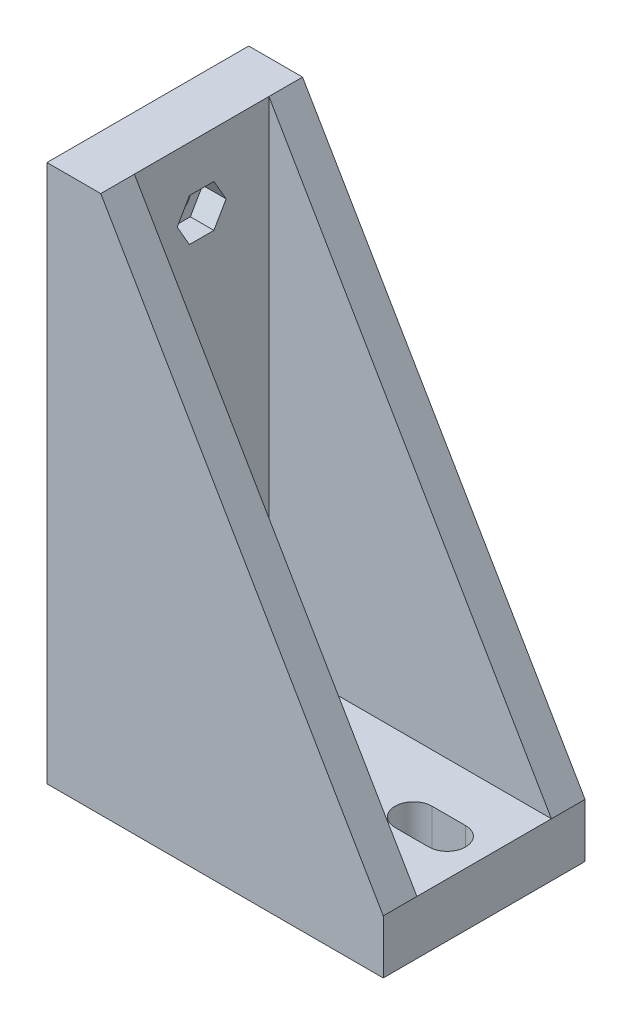
ISO-10303-21;
HEADER;
FILE_DESCRIPTION(('STEP AP214'),'2;1');
FILE_NAME('part.step','',(''),(''),'','','');
FILE_SCHEMA(('AUTOMOTIVE_DESIGN { 1 0 10303 214 1 1 1 1 }'));
ENDSEC;
DATA;
#1=APPLICATION_CONTEXT('core data for automotive mechanical design processes');
#2=APPLICATION_PROTOCOL_DEFINITION('international standard','automotive_design',2000,#1);
#3=PRODUCT_CONTEXT('',#1,'mechanical');
#4=PRODUCT('Part','Part','',(#3));
#5=PRODUCT_RELATED_PRODUCT_CATEGORY('part','',(#4));
#6=PRODUCT_DEFINITION_FORMATION('','',#4);
#7=PRODUCT_DEFINITION_CONTEXT('part definition',#1,'design');
#8=PRODUCT_DEFINITION('design','',#6,#7);
#9=PRODUCT_DEFINITION_SHAPE('','',#8);
#10=(LENGTH_UNIT() NAMED_UNIT(*) SI_UNIT(.MILLI.,.METRE.));
#11=(NAMED_UNIT(*) PLANE_ANGLE_UNIT() SI_UNIT($,.RADIAN.));
#12=(NAMED_UNIT(*) SI_UNIT($,.STERADIAN.) SOLID_ANGLE_UNIT());
#13=UNCERTAINTY_MEASURE_WITH_UNIT(LENGTH_MEASURE(1.E-05),#10,'distance_accuracy_value','');
#14=(GEOMETRIC_REPRESENTATION_CONTEXT(3) GLOBAL_UNCERTAINTY_ASSIGNED_CONTEXT((#13)) GLOBAL_UNIT_ASSIGNED_CONTEXT((#10,
#11,#12)) REPRESENTATION_CONTEXT('',''));
#15=CARTESIAN_POINT('',(0.,0.,0.));
#16=DIRECTION('',(0.,0.,1.));
#17=DIRECTION('',(1.,0.,0.));
#18=AXIS2_PLACEMENT_3D('',#15,#16,#17);
#19=CARTESIAN_POINT('',(8.,8.,15.));
#20=DIRECTION('',(0.,-1.,0.));
#21=DIRECTION('',(1.,0.,0.));
#22=AXIS2_PLACEMENT_3D('',#19,#20,#21);
#23=PLANE('',#22);
#24=DIRECTION('',(1.,0.,0.));
#25=VECTOR('',#24,1.);
#26=CARTESIAN_POINT('',(8.,8.,-10.));
#27=LINE('',#26,#25);
#28=CARTESIAN_POINT('',(8.,8.,-10.));
#29=VERTEX_POINT('',#28);
#30=CARTESIAN_POINT('',(50.,8.,-10.));
#31=VERTEX_POINT('',#30);
#32=EDGE_CURVE('E303',#29,#31,#27,.T.);
#33=ORIENTED_EDGE('',*,*,#32,.F.);
#34=DIRECTION('',(0.,0.,-1.));
#35=VECTOR('',#34,1.);
#36=CARTESIAN_POINT('',(8.,8.,15.));
#37=LINE('',#36,#35);
#38=CARTESIAN_POINT('',(8.,8.00000000000001,10.));
#39=VERTEX_POINT('',#38);
#40=EDGE_CURVE('E360',#39,#29,#37,.T.);
#41=ORIENTED_EDGE('',*,*,#40,.F.);
#42=DIRECTION('',(-1.,0.,0.));
#43=VECTOR('',#42,1.);
#44=CARTESIAN_POINT('',(8.,8.,10.));
#45=LINE('',#44,#43);
#46=CARTESIAN_POINT('',(50.,8.,10.));
#47=VERTEX_POINT('',#46);
#48=EDGE_CURVE('E317',#47,#39,#45,.T.);
#49=ORIENTED_EDGE('',*,*,#48,.F.);
#50=DIRECTION('',(0.,0.,-1.));
#51=VECTOR('',#50,1.);
#52=CARTESIAN_POINT('',(50.,8.,15.));
#53=LINE('',#52,#51);
#54=EDGE_CURVE('E364',#47,#31,#53,.T.);
#55=ORIENTED_EDGE('',*,*,#54,.T.);
#56=EDGE_LOOP('',(#33,#41,#49,#55));
#57=FACE_BOUND('',#56,.T.);
#58=DIRECTION('',(1.,0.,0.));
#59=VECTOR('',#58,1.);
#60=CARTESIAN_POINT('',(39.5,8.,-2.75));
#61=LINE('',#60,#59);
#62=CARTESIAN_POINT('',(39.5,8.,-2.75));
#63=VERTEX_POINT('',#62);
#64=CARTESIAN_POINT('',(44.5,8.,-2.75));
#65=VERTEX_POINT('',#64);
#66=EDGE_CURVE('E64',#63,#65,#61,.T.);
#67=ORIENTED_EDGE('',*,*,#66,.T.);
#68=CARTESIAN_POINT('',(44.5,8.,0.));
#69=DIRECTION('',(0.,1.,0.));
#70=DIRECTION('',(-1.,0.,0.));
#71=AXIS2_PLACEMENT_3D('',#68,#69,#70);
#72=CIRCLE('',#71,2.75);
#73=CARTESIAN_POINT('',(44.5,8.,2.75));
#74=VERTEX_POINT('',#73);
#75=EDGE_CURVE('E189',#74,#65,#72,.T.);
#76=ORIENTED_EDGE('',*,*,#75,.F.);
#77=DIRECTION('',(1.,0.,0.));
#78=VECTOR('',#77,1.);
#79=CARTESIAN_POINT('',(39.5,8.,2.75));
#80=LINE('',#79,#78);
#81=CARTESIAN_POINT('',(39.5,8.,2.75));
#82=VERTEX_POINT('',#81);
#83=EDGE_CURVE('E206',#82,#74,#80,.T.);
#84=ORIENTED_EDGE('',*,*,#83,.F.);
#85=CARTESIAN_POINT('',(39.5,8.,0.));
#86=DIRECTION('',(0.,1.,0.));
#87=DIRECTION('',(-1.,0.,0.));
#88=AXIS2_PLACEMENT_3D('',#85,#86,#87);
#89=CIRCLE('',#88,2.75);
#90=EDGE_CURVE('E183',#63,#82,#89,.T.);
#91=ORIENTED_EDGE('',*,*,#90,.F.);
#92=EDGE_LOOP('',(#67,#76,#84,#91));
#93=FACE_BOUND('',#92,.T.);
#94=ADVANCED_FACE('F47',(#57,#93),#23,.F.);
#95=CARTESIAN_POINT('',(50.,0.,15.));
#96=DIRECTION('',(0.,1.,0.));
#97=DIRECTION('',(-1.,0.,0.));
#98=AXIS2_PLACEMENT_3D('',#95,#96,#97);
#99=PLANE('',#98);
#100=DIRECTION('',(1.,0.,0.));
#101=VECTOR('',#100,1.);
#102=CARTESIAN_POINT('',(50.,0.,-15.));
#103=LINE('',#102,#101);
#104=CARTESIAN_POINT('',(0.,0.,-15.));
#105=VERTEX_POINT('',#104);
#106=CARTESIAN_POINT('',(50.,0.,-15.));
#107=VERTEX_POINT('',#106);
#108=EDGE_CURVE('E320',#105,#107,#103,.T.);
#109=ORIENTED_EDGE('',*,*,#108,.T.);
#110=DIRECTION('',(0.,0.,-1.));
#111=VECTOR('',#110,1.);
#112=CARTESIAN_POINT('',(50.,0.,15.));
#113=LINE('',#112,#111);
#114=CARTESIAN_POINT('',(50.,0.,15.));
#115=VERTEX_POINT('',#114);
#116=EDGE_CURVE('E12',#115,#107,#113,.T.);
#117=ORIENTED_EDGE('',*,*,#116,.F.);
#118=DIRECTION('',(1.,0.,0.));
#119=VECTOR('',#118,1.);
#120=CARTESIAN_POINT('',(50.,0.,15.));
#121=LINE('',#120,#119);
#122=CARTESIAN_POINT('',(0.,0.,15.));
#123=VERTEX_POINT('',#122);
#124=EDGE_CURVE('E321',#123,#115,#121,.T.);
#125=ORIENTED_EDGE('',*,*,#124,.F.);
#126=DIRECTION('',(0.,0.,-1.));
#127=VECTOR('',#126,1.);
#128=CARTESIAN_POINT('',(0.,0.,15.));
#129=LINE('',#128,#127);
#130=EDGE_CURVE('E336',#123,#105,#129,.T.);
#131=ORIENTED_EDGE('',*,*,#130,.T.);
#132=EDGE_LOOP('',(#109,#117,#125,#131));
#133=FACE_BOUND('',#132,.T.);
#134=DIRECTION('',(1.,0.,0.));
#135=VECTOR('',#134,1.);
#136=CARTESIAN_POINT('',(39.5,0.,-2.75));
#137=LINE('',#136,#135);
#138=CARTESIAN_POINT('',(39.5,0.,-2.75));
#139=VERTEX_POINT('',#138);
#140=CARTESIAN_POINT('',(44.5,0.,-2.75));
#141=VERTEX_POINT('',#140);
#142=EDGE_CURVE('E171',#139,#141,#137,.T.);
#143=ORIENTED_EDGE('',*,*,#142,.F.);
#144=CARTESIAN_POINT('',(39.5,0.,0.));
#145=DIRECTION('',(0.,1.,0.));
#146=DIRECTION('',(-1.,0.,0.));
#147=AXIS2_PLACEMENT_3D('',#144,#145,#146);
#148=CIRCLE('',#147,2.75);
#149=CARTESIAN_POINT('',(39.5,0.,2.75));
#150=VERTEX_POINT('',#149);
#151=EDGE_CURVE('E197',#139,#150,#148,.T.);
#152=ORIENTED_EDGE('',*,*,#151,.T.);
#153=DIRECTION('',(1.,0.,0.));
#154=VECTOR('',#153,1.);
#155=CARTESIAN_POINT('',(39.5,0.,2.75));
#156=LINE('',#155,#154);
#157=CARTESIAN_POINT('',(44.5,0.,2.75));
#158=VERTEX_POINT('',#157);
#159=EDGE_CURVE('E72',#150,#158,#156,.T.);
#160=ORIENTED_EDGE('',*,*,#159,.T.);
#161=CARTESIAN_POINT('',(44.5,0.,0.));
#162=DIRECTION('',(0.,1.,0.));
#163=DIRECTION('',(-1.,0.,0.));
#164=AXIS2_PLACEMENT_3D('',#161,#162,#163);
#165=CIRCLE('',#164,2.75);
#166=EDGE_CURVE('E182',#158,#141,#165,.T.);
#167=ORIENTED_EDGE('',*,*,#166,.T.);
#168=EDGE_LOOP('',(#143,#152,#160,#167));
#169=FACE_BOUND('',#168,.T.);
#170=ADVANCED_FACE('F49',(#133,#169),#99,.F.);
#171=CARTESIAN_POINT('',(8.,70.,0.));
#172=DIRECTION('',(1.,0.,0.));
#173=DIRECTION('',(0.,0.,-1.));
#174=AXIS2_PLACEMENT_3D('',#171,#172,#173);
#175=CYLINDRICAL_SURFACE('',#174,1.8);
#176=CARTESIAN_POINT('',(0.,70.,0.));
#177=DIRECTION('',(1.,0.,0.));
#178=DIRECTION('',(0.,0.,-1.));
#179=AXIS2_PLACEMENT_3D('',#176,#177,#178);
#180=CIRCLE('',#179,1.8);
#181=CARTESIAN_POINT('',(0.,70.,-1.8));
#182=VERTEX_POINT('',#181);
#183=EDGE_CURVE('E279',#182,#182,#180,.T.);
#184=ORIENTED_EDGE('',*,*,#183,.F.);
#185=EDGE_LOOP('',(#184));
#186=FACE_BOUND('',#185,.T.);
#187=CARTESIAN_POINT('',(4.5,70.,0.));
#188=DIRECTION('',(1.,0.,0.));
#189=DIRECTION('',(0.,0.,-1.));
#190=AXIS2_PLACEMENT_3D('',#187,#188,#189);
#191=CIRCLE('',#190,1.8);
#192=CARTESIAN_POINT('',(4.5,70.,-1.8));
#193=VERTEX_POINT('',#192);
#194=EDGE_CURVE('E51',#193,#193,#191,.F.);
#195=ORIENTED_EDGE('',*,*,#194,.F.);
#196=EDGE_LOOP('',(#195));
#197=FACE_BOUND('',#196,.T.);
#198=ADVANCED_FACE('F415',(#186,#197),#175,.F.);
#199=CARTESIAN_POINT('',(8.,80.,15.));
#200=DIRECTION('',(-1.,0.,0.));
#201=DIRECTION('',(0.,-1.,0.));
#202=AXIS2_PLACEMENT_3D('',#199,#200,#201);
#203=PLANE('',#202);
#204=DIRECTION('',(0.,0.866025403784439,0.499999999999999));
#205=VECTOR('',#204,1.);
#206=CARTESIAN_POINT('',(8.,70.,-3.63730669589465));
#207=LINE('',#206,#205);
#208=CARTESIAN_POINT('',(8.,70.,-3.63730669589465));
#209=VERTEX_POINT('',#208);
#210=CARTESIAN_POINT('',(8.,73.15,-1.81865334794733));
#211=VERTEX_POINT('',#210);
#212=EDGE_CURVE('E239',#209,#211,#207,.T.);
#213=ORIENTED_EDGE('',*,*,#212,.F.);
#214=DIRECTION('',(0.,0.866025403784438,-0.500000000000001));
#215=VECTOR('',#214,1.);
#216=CARTESIAN_POINT('',(8.,66.85,-1.81865334794732));
#217=LINE('',#216,#215);
#218=CARTESIAN_POINT('',(8.,66.85,-1.81865334794732));
#219=VERTEX_POINT('',#218);
#220=EDGE_CURVE('E191',#219,#209,#217,.T.);
#221=ORIENTED_EDGE('',*,*,#220,.F.);
#222=DIRECTION('',(0.,0.,-1.));
#223=VECTOR('',#222,1.);
#224=CARTESIAN_POINT('',(8.,66.85,1.81865334794732));
#225=LINE('',#224,#223);
#226=CARTESIAN_POINT('',(8.,66.85,1.81865334794732));
#227=VERTEX_POINT('',#226);
#228=EDGE_CURVE('E255',#227,#219,#225,.T.);
#229=ORIENTED_EDGE('',*,*,#228,.F.);
#230=DIRECTION('',(0.,-0.866025403784439,-0.5));
#231=VECTOR('',#230,1.);
#232=CARTESIAN_POINT('',(8.,70.,3.63730669589465));
#233=LINE('',#232,#231);
#234=CARTESIAN_POINT('',(8.,70.,3.63730669589465));
#235=VERTEX_POINT('',#234);
#236=EDGE_CURVE('E251',#235,#227,#233,.T.);
#237=ORIENTED_EDGE('',*,*,#236,.F.);
#238=DIRECTION('',(0.,-0.866025403784438,0.5));
#239=VECTOR('',#238,1.);
#240=CARTESIAN_POINT('',(8.,73.15,1.81865334794732));
#241=LINE('',#240,#239);
#242=CARTESIAN_POINT('',(8.,73.15,1.81865334794732));
#243=VERTEX_POINT('',#242);
#244=EDGE_CURVE('E247',#243,#235,#241,.T.);
#245=ORIENTED_EDGE('',*,*,#244,.F.);
#246=DIRECTION('',(0.,0.,1.));
#247=VECTOR('',#246,1.);
#248=CARTESIAN_POINT('',(8.,73.15,-1.81865334794733));
#249=LINE('',#248,#247);
#250=EDGE_CURVE('E243',#211,#243,#249,.T.);
#251=ORIENTED_EDGE('',*,*,#250,.F.);
#252=EDGE_LOOP('',(#213,#221,#229,#237,#245,#251));
#253=FACE_BOUND('',#252,.T.);
#254=DIRECTION('',(0.,-1.,0.));
#255=VECTOR('',#254,1.);
#256=CARTESIAN_POINT('',(8.,80.,-10.));
#257=LINE('',#256,#255);
#258=CARTESIAN_POINT('',(8.,80.,-10.));
#259=VERTEX_POINT('',#258);
#260=EDGE_CURVE('E299',#259,#29,#257,.T.);
#261=ORIENTED_EDGE('',*,*,#260,.F.);
#262=DIRECTION('',(0.,0.,-1.));
#263=VECTOR('',#262,1.);
#264=CARTESIAN_POINT('',(8.,80.,15.));
#265=LINE('',#264,#263);
#266=CARTESIAN_POINT('',(8.,80.,10.));
#267=VERTEX_POINT('',#266);
#268=EDGE_CURVE('E355',#267,#259,#265,.T.);
#269=ORIENTED_EDGE('',*,*,#268,.F.);
#270=DIRECTION('',(0.,1.,0.));
#271=VECTOR('',#270,1.);
#272=CARTESIAN_POINT('',(8.,80.,10.));
#273=LINE('',#272,#271);
#274=EDGE_CURVE('E311',#39,#267,#273,.T.);
#275=ORIENTED_EDGE('',*,*,#274,.F.);
#276=ORIENTED_EDGE('',*,*,#40,.T.);
#277=EDGE_LOOP('',(#261,#269,#275,#276));
#278=FACE_BOUND('',#277,.T.);
#279=ADVANCED_FACE('F407',(#253,#278),#203,.F.);
#280=CARTESIAN_POINT('',(50.,8.,15.));
#281=DIRECTION('',(-1.,0.,0.));
#282=DIRECTION('',(0.,0.,1.));
#283=AXIS2_PLACEMENT_3D('',#280,#281,#282);
#284=PLANE('',#283);
#285=DIRECTION('',(0.,0.,-1.));
#286=VECTOR('',#285,1.);
#287=CARTESIAN_POINT('',(50.,7.99999999999999,15.));
#288=LINE('',#287,#286);
#289=CARTESIAN_POINT('',(50.,8.,-15.));
#290=VERTEX_POINT('',#289);
#291=EDGE_CURVE('E295',#31,#290,#288,.T.);
#292=ORIENTED_EDGE('',*,*,#291,.F.);
#293=ORIENTED_EDGE('',*,*,#54,.F.);
#294=CARTESIAN_POINT('',(50.,8.00000000000005,15.));
#295=VERTEX_POINT('',#294);
#296=EDGE_CURVE('E57',#295,#47,#53,.T.);
#297=ORIENTED_EDGE('',*,*,#296,.F.);
#298=DIRECTION('',(0.,1.,0.));
#299=VECTOR('',#298,1.);
#300=CARTESIAN_POINT('',(50.,8.,15.));
#301=LINE('',#300,#299);
#302=EDGE_CURVE('E325',#115,#295,#301,.T.);
#303=ORIENTED_EDGE('',*,*,#302,.F.);
#304=ORIENTED_EDGE('',*,*,#116,.T.);
#305=DIRECTION('',(0.,1.,0.));
#306=VECTOR('',#305,1.);
#307=CARTESIAN_POINT('',(50.,8.,-15.));
#308=LINE('',#307,#306);
#309=EDGE_CURVE('E340',#107,#290,#308,.T.);
#310=ORIENTED_EDGE('',*,*,#309,.T.);
#311=EDGE_LOOP('',(#292,#293,#297,#303,#304,#310));
#312=FACE_BOUND('',#311,.T.);
#313=ADVANCED_FACE('F423',(#312),#284,.F.);
#314=CARTESIAN_POINT('',(0.,80.,15.));
#315=DIRECTION('',(0.,-1.,0.));
#316=DIRECTION('',(0.,0.,-1.));
#317=AXIS2_PLACEMENT_3D('',#314,#315,#316);
#318=PLANE('',#317);
#319=DIRECTION('',(-1.,0.,0.));
#320=VECTOR('',#319,1.);
#321=CARTESIAN_POINT('',(0.,80.,-15.));
#322=LINE('',#321,#320);
#323=CARTESIAN_POINT('',(8.,80.,-15.));
#324=VERTEX_POINT('',#323);
#325=CARTESIAN_POINT('',(0.,80.,-15.));
#326=VERTEX_POINT('',#325);
#327=EDGE_CURVE('E343',#324,#326,#322,.T.);
#328=ORIENTED_EDGE('',*,*,#327,.T.);
#329=DIRECTION('',(0.,0.,-1.));
#330=VECTOR('',#329,1.);
#331=CARTESIAN_POINT('',(0.,80.,15.));
#332=LINE('',#331,#330);
#333=CARTESIAN_POINT('',(0.,80.,15.));
#334=VERTEX_POINT('',#333);
#335=EDGE_CURVE('E352',#334,#326,#332,.T.);
#336=ORIENTED_EDGE('',*,*,#335,.F.);
#337=DIRECTION('',(-1.,0.,0.));
#338=VECTOR('',#337,1.);
#339=CARTESIAN_POINT('',(0.,80.,15.));
#340=LINE('',#339,#338);
#341=CARTESIAN_POINT('',(8.,80.,15.));
#342=VERTEX_POINT('',#341);
#343=EDGE_CURVE('E330',#342,#334,#340,.T.);
#344=ORIENTED_EDGE('',*,*,#343,.F.);
#345=EDGE_CURVE('E356',#342,#267,#265,.T.);
#346=ORIENTED_EDGE('',*,*,#345,.T.);
#347=ORIENTED_EDGE('',*,*,#268,.T.);
#348=DIRECTION('',(0.,0.,1.));
#349=VECTOR('',#348,1.);
#350=CARTESIAN_POINT('',(8.,80.,15.));
#351=LINE('',#350,#349);
#352=EDGE_CURVE('E288',#324,#259,#351,.T.);
#353=ORIENTED_EDGE('',*,*,#352,.F.);
#354=EDGE_LOOP('',(#328,#336,#344,#346,#347,#353));
#355=FACE_BOUND('',#354,.T.);
#356=ADVANCED_FACE('F386',(#355),#318,.F.);
#357=CARTESIAN_POINT('',(0.,0.,15.));
#358=DIRECTION('',(1.,0.,0.));
#359=DIRECTION('',(0.,0.,-1.));
#360=AXIS2_PLACEMENT_3D('',#357,#358,#359);
#361=PLANE('',#360);
#362=ORIENTED_EDGE('',*,*,#183,.T.);
#363=EDGE_LOOP('',(#362));
#364=FACE_BOUND('',#363,.T.);
#365=DIRECTION('',(0.,-1.,0.));
#366=VECTOR('',#365,1.);
#367=CARTESIAN_POINT('',(0.,0.,-15.));
#368=LINE('',#367,#366);
#369=EDGE_CURVE('E326',#326,#105,#368,.T.);
#370=ORIENTED_EDGE('',*,*,#369,.T.);
#371=ORIENTED_EDGE('',*,*,#130,.F.);
#372=DIRECTION('',(0.,-1.,0.));
#373=VECTOR('',#372,1.);
#374=CARTESIAN_POINT('',(0.,0.,15.));
#375=LINE('',#374,#373);
#376=EDGE_CURVE('E333',#334,#123,#375,.T.);
#377=ORIENTED_EDGE('',*,*,#376,.F.);
#378=ORIENTED_EDGE('',*,*,#335,.T.);
#379=EDGE_LOOP('',(#370,#371,#377,#378));
#380=FACE_BOUND('',#379,.T.);
#381=ADVANCED_FACE('F396',(#364,#380),#361,.F.);
#382=CARTESIAN_POINT('',(0.,0.,15.));
#383=DIRECTION('',(0.,0.,-1.));
#384=DIRECTION('',(-1.,0.,0.));
#385=AXIS2_PLACEMENT_3D('',#382,#383,#384);
#386=PLANE('',#385);
#387=ORIENTED_EDGE('',*,*,#124,.T.);
#388=ORIENTED_EDGE('',*,*,#302,.T.);
#389=DIRECTION('',(0.503871025524086,-0.863778900898433,0.));
#390=VECTOR('',#389,1.);
#391=CARTESIAN_POINT('',(8.,80.,15.));
#392=LINE('',#391,#390);
#393=EDGE_CURVE('E308',#342,#295,#392,.T.);
#394=ORIENTED_EDGE('',*,*,#393,.F.);
#395=ORIENTED_EDGE('',*,*,#343,.T.);
#396=ORIENTED_EDGE('',*,*,#376,.T.);
#397=EDGE_LOOP('',(#387,#388,#394,#395,#396));
#398=FACE_BOUND('',#397,.T.);
#399=ADVANCED_FACE('F402',(#398),#386,.F.);
#400=CARTESIAN_POINT('',(0.,0.,-15.));
#401=DIRECTION('',(0.,0.,-1.));
#402=DIRECTION('',(-1.,0.,0.));
#403=AXIS2_PLACEMENT_3D('',#400,#401,#402);
#404=PLANE('',#403);
#405=ORIENTED_EDGE('',*,*,#327,.F.);
#406=DIRECTION('',(0.503871025524086,-0.863778900898433,0.));
#407=VECTOR('',#406,1.);
#408=CARTESIAN_POINT('',(8.,80.,-15.));
#409=LINE('',#408,#407);
#410=EDGE_CURVE('E284',#324,#290,#409,.T.);
#411=ORIENTED_EDGE('',*,*,#410,.T.);
#412=ORIENTED_EDGE('',*,*,#309,.F.);
#413=ORIENTED_EDGE('',*,*,#108,.F.);
#414=ORIENTED_EDGE('',*,*,#369,.F.);
#415=EDGE_LOOP('',(#405,#411,#412,#413,#414));
#416=FACE_BOUND('',#415,.T.);
#417=ADVANCED_FACE('F391',(#416),#404,.T.);
#418=CARTESIAN_POINT('',(25.,40.,10.));
#419=DIRECTION('',(0.,0.,1.));
#420=DIRECTION('',(1.,0.,0.));
#421=AXIS2_PLACEMENT_3D('',#418,#419,#420);
#422=PLANE('',#421);
#423=DIRECTION('',(0.503871025524086,-0.863778900898433,0.));
#424=VECTOR('',#423,1.);
#425=CARTESIAN_POINT('',(8.,80.,10.));
#426=LINE('',#425,#424);
#427=EDGE_CURVE('E307',#267,#47,#426,.T.);
#428=ORIENTED_EDGE('',*,*,#427,.T.);
#429=ORIENTED_EDGE('',*,*,#48,.T.);
#430=ORIENTED_EDGE('',*,*,#274,.T.);
#431=EDGE_LOOP('',(#428,#429,#430));
#432=FACE_BOUND('',#431,.T.);
#433=ADVANCED_FACE('F450',(#432),#422,.F.);
#434=CARTESIAN_POINT('',(8.,80.,15.));
#435=DIRECTION('',(-0.863778900898434,-0.503871025524086,0.));
#436=DIRECTION('',(0.503871025524086,-0.863778900898433,0.));
#437=AXIS2_PLACEMENT_3D('',#434,#435,#436);
#438=PLANE('',#437);
#439=ORIENTED_EDGE('',*,*,#296,.T.);
#440=ORIENTED_EDGE('',*,*,#427,.F.);
#441=ORIENTED_EDGE('',*,*,#345,.F.);
#442=ORIENTED_EDGE('',*,*,#393,.T.);
#443=EDGE_LOOP('',(#439,#440,#441,#442));
#444=FACE_BOUND('',#443,.T.);
#445=ADVANCED_FACE('F403',(#444),#438,.F.);
#446=CARTESIAN_POINT('',(25.,40.,-10.));
#447=DIRECTION('',(0.,0.,-1.));
#448=DIRECTION('',(-1.,0.,0.));
#449=AXIS2_PLACEMENT_3D('',#446,#447,#448);
#450=PLANE('',#449);
#451=ORIENTED_EDGE('',*,*,#260,.T.);
#452=ORIENTED_EDGE('',*,*,#32,.T.);
#453=DIRECTION('',(0.503871025524086,-0.863778900898433,0.));
#454=VECTOR('',#453,1.);
#455=CARTESIAN_POINT('',(8.,80.,-10.));
#456=LINE('',#455,#454);
#457=EDGE_CURVE('E283',#259,#31,#456,.T.);
#458=ORIENTED_EDGE('',*,*,#457,.F.);
#459=EDGE_LOOP('',(#451,#452,#458));
#460=FACE_BOUND('',#459,.T.);
#461=ADVANCED_FACE('F379',(#460),#450,.F.);
#462=CARTESIAN_POINT('',(8.,80.,-15.));
#463=DIRECTION('',(0.863778900898434,0.503871025524086,0.));
#464=DIRECTION('',(0.503871025524086,-0.863778900898433,0.));
#465=AXIS2_PLACEMENT_3D('',#462,#463,#464);
#466=PLANE('',#465);
#467=ORIENTED_EDGE('',*,*,#457,.T.);
#468=ORIENTED_EDGE('',*,*,#291,.T.);
#469=ORIENTED_EDGE('',*,*,#410,.F.);
#470=ORIENTED_EDGE('',*,*,#352,.T.);
#471=EDGE_LOOP('',(#467,#468,#469,#470));
#472=FACE_BOUND('',#471,.T.);
#473=ADVANCED_FACE('F381',(#472),#466,.T.);
#474=CARTESIAN_POINT('',(4.5,0.,15.));
#475=DIRECTION('',(1.,0.,0.));
#476=DIRECTION('',(0.,0.,-1.));
#477=AXIS2_PLACEMENT_3D('',#474,#475,#476);
#478=PLANE('',#477);
#479=DIRECTION('',(0.,-0.866025403784438,0.500000000000001));
#480=VECTOR('',#479,1.);
#481=CARTESIAN_POINT('',(4.5,66.85,-1.81865334794732));
#482=LINE('',#481,#480);
#483=CARTESIAN_POINT('',(4.5,70.,-3.63730669589465));
#484=VERTEX_POINT('',#483);
#485=CARTESIAN_POINT('',(4.5,66.85,-1.81865334794732));
#486=VERTEX_POINT('',#485);
#487=EDGE_CURVE('E233',#484,#486,#482,.T.);
#488=ORIENTED_EDGE('',*,*,#487,.F.);
#489=DIRECTION('',(0.,-0.866025403784439,-0.499999999999999));
#490=VECTOR('',#489,1.);
#491=CARTESIAN_POINT('',(4.5,70.,-3.63730669589465));
#492=LINE('',#491,#490);
#493=CARTESIAN_POINT('',(4.5,73.15,-1.81865334794733));
#494=VERTEX_POINT('',#493);
#495=EDGE_CURVE('E236',#494,#484,#492,.T.);
#496=ORIENTED_EDGE('',*,*,#495,.F.);
#497=DIRECTION('',(0.,0.,-1.));
#498=VECTOR('',#497,1.);
#499=CARTESIAN_POINT('',(4.5,73.15,-1.81865334794733));
#500=LINE('',#499,#498);
#501=CARTESIAN_POINT('',(4.5,73.15,1.81865334794732));
#502=VERTEX_POINT('',#501);
#503=EDGE_CURVE('E220',#502,#494,#500,.T.);
#504=ORIENTED_EDGE('',*,*,#503,.F.);
#505=DIRECTION('',(0.,0.866025403784439,-0.5));
#506=VECTOR('',#505,1.);
#507=CARTESIAN_POINT('',(4.5,73.15,1.81865334794732));
#508=LINE('',#507,#506);
#509=CARTESIAN_POINT('',(4.5,70.,3.63730669589465));
#510=VERTEX_POINT('',#509);
#511=EDGE_CURVE('E223',#510,#502,#508,.T.);
#512=ORIENTED_EDGE('',*,*,#511,.F.);
#513=DIRECTION('',(0.,0.866025403784439,0.5));
#514=VECTOR('',#513,1.);
#515=CARTESIAN_POINT('',(4.5,70.,3.63730669589465));
#516=LINE('',#515,#514);
#517=CARTESIAN_POINT('',(4.5,66.85,1.81865334794732));
#518=VERTEX_POINT('',#517);
#519=EDGE_CURVE('E227',#518,#510,#516,.T.);
#520=ORIENTED_EDGE('',*,*,#519,.F.);
#521=DIRECTION('',(0.,0.,1.));
#522=VECTOR('',#521,1.);
#523=CARTESIAN_POINT('',(4.5,66.85,1.81865334794732));
#524=LINE('',#523,#522);
#525=EDGE_CURVE('E230',#486,#518,#524,.T.);
#526=ORIENTED_EDGE('',*,*,#525,.F.);
#527=EDGE_LOOP('',(#488,#496,#504,#512,#520,#526));
#528=FACE_BOUND('',#527,.T.);
#529=ORIENTED_EDGE('',*,*,#194,.T.);
#530=EDGE_LOOP('',(#529));
#531=FACE_BOUND('',#530,.T.);
#532=ADVANCED_FACE('F413',(#528,#531),#478,.T.);
#533=CARTESIAN_POINT('',(-9.62340895940728,66.85,-1.81865334794732));
#534=DIRECTION('',(0.,-0.500000000000001,-0.866025403784438));
#535=DIRECTION('',(0.,0.866025403784438,-0.500000000000001));
#536=AXIS2_PLACEMENT_3D('',#533,#534,#535);
#537=PLANE('',#536);
#538=ORIENTED_EDGE('',*,*,#487,.T.);
#539=DIRECTION('',(1.,0.,0.));
#540=VECTOR('',#539,1.);
#541=CARTESIAN_POINT('',(-9.62340895940728,66.85,-1.81865334794732));
#542=LINE('',#541,#540);
#543=EDGE_CURVE('E224',#486,#219,#542,.T.);
#544=ORIENTED_EDGE('',*,*,#543,.T.);
#545=ORIENTED_EDGE('',*,*,#220,.T.);
#546=DIRECTION('',(1.,0.,0.));
#547=VECTOR('',#546,1.);
#548=CARTESIAN_POINT('',(-9.62340895940728,70.,-3.63730669589465));
#549=LINE('',#548,#547);
#550=EDGE_CURVE('E259',#484,#209,#549,.T.);
#551=ORIENTED_EDGE('',*,*,#550,.F.);
#552=EDGE_LOOP('',(#538,#544,#545,#551));
#553=FACE_BOUND('',#552,.T.);
#554=ADVANCED_FACE('F518',(#553),#537,.F.);
#555=CARTESIAN_POINT('',(-9.62340895940728,66.85,1.81865334794732));
#556=DIRECTION('',(0.,-1.,0.));
#557=DIRECTION('',(1.,0.,0.));
#558=AXIS2_PLACEMENT_3D('',#555,#556,#557);
#559=PLANE('',#558);
#560=ORIENTED_EDGE('',*,*,#525,.T.);
#561=DIRECTION('',(1.,0.,0.));
#562=VECTOR('',#561,1.);
#563=CARTESIAN_POINT('',(-9.62340895940728,66.85,1.81865334794732));
#564=LINE('',#563,#562);
#565=EDGE_CURVE('E262',#518,#227,#564,.T.);
#566=ORIENTED_EDGE('',*,*,#565,.T.);
#567=ORIENTED_EDGE('',*,*,#228,.T.);
#568=ORIENTED_EDGE('',*,*,#543,.F.);
#569=EDGE_LOOP('',(#560,#566,#567,#568));
#570=FACE_BOUND('',#569,.T.);
#571=ADVANCED_FACE('F527',(#570),#559,.F.);
#572=CARTESIAN_POINT('',(-9.62340895940728,70.,3.63730669589465));
#573=DIRECTION('',(0.,-0.5,0.866025403784439));
#574=DIRECTION('',(0.,-0.866025403784439,-0.5));
#575=AXIS2_PLACEMENT_3D('',#572,#573,#574);
#576=PLANE('',#575);
#577=ORIENTED_EDGE('',*,*,#519,.T.);
#578=DIRECTION('',(1.,0.,0.));
#579=VECTOR('',#578,1.);
#580=CARTESIAN_POINT('',(-9.62340895940728,70.,3.63730669589465));
#581=LINE('',#580,#579);
#582=EDGE_CURVE('E265',#510,#235,#581,.T.);
#583=ORIENTED_EDGE('',*,*,#582,.T.);
#584=ORIENTED_EDGE('',*,*,#236,.T.);
#585=ORIENTED_EDGE('',*,*,#565,.F.);
#586=EDGE_LOOP('',(#577,#583,#584,#585));
#587=FACE_BOUND('',#586,.T.);
#588=ADVANCED_FACE('F535',(#587),#576,.F.);
#589=CARTESIAN_POINT('',(-9.62340895940728,73.15,1.81865334794732));
#590=DIRECTION('',(0.,0.5,0.866025403784438));
#591=DIRECTION('',(0.,-0.866025403784439,0.5));
#592=AXIS2_PLACEMENT_3D('',#589,#590,#591);
#593=PLANE('',#592);
#594=ORIENTED_EDGE('',*,*,#511,.T.);
#595=DIRECTION('',(1.,0.,0.));
#596=VECTOR('',#595,1.);
#597=CARTESIAN_POINT('',(-9.62340895940728,73.15,1.81865334794732));
#598=LINE('',#597,#596);
#599=EDGE_CURVE('E268',#502,#243,#598,.T.);
#600=ORIENTED_EDGE('',*,*,#599,.T.);
#601=ORIENTED_EDGE('',*,*,#244,.T.);
#602=ORIENTED_EDGE('',*,*,#582,.F.);
#603=EDGE_LOOP('',(#594,#600,#601,#602));
#604=FACE_BOUND('',#603,.T.);
#605=ADVANCED_FACE('F544',(#604),#593,.F.);
#606=CARTESIAN_POINT('',(-9.62340895940728,73.15,-1.81865334794733));
#607=DIRECTION('',(0.,1.,0.));
#608=DIRECTION('',(-1.,0.,0.));
#609=AXIS2_PLACEMENT_3D('',#606,#607,#608);
#610=PLANE('',#609);
#611=ORIENTED_EDGE('',*,*,#503,.T.);
#612=DIRECTION('',(1.,0.,0.));
#613=VECTOR('',#612,1.);
#614=CARTESIAN_POINT('',(-9.62340895940728,73.15,-1.81865334794733));
#615=LINE('',#614,#613);
#616=EDGE_CURVE('E271',#494,#211,#615,.T.);
#617=ORIENTED_EDGE('',*,*,#616,.T.);
#618=ORIENTED_EDGE('',*,*,#250,.T.);
#619=ORIENTED_EDGE('',*,*,#599,.F.);
#620=EDGE_LOOP('',(#611,#617,#618,#619));
#621=FACE_BOUND('',#620,.T.);
#622=ADVANCED_FACE('F553',(#621),#610,.F.);
#623=CARTESIAN_POINT('',(-9.62340895940728,70.,-3.63730669589465));
#624=DIRECTION('',(0.,0.499999999999999,-0.866025403784439));
#625=DIRECTION('',(0.,0.866025403784439,0.499999999999999));
#626=AXIS2_PLACEMENT_3D('',#623,#624,#625);
#627=PLANE('',#626);
#628=ORIENTED_EDGE('',*,*,#495,.T.);
#629=ORIENTED_EDGE('',*,*,#550,.T.);
#630=ORIENTED_EDGE('',*,*,#212,.T.);
#631=ORIENTED_EDGE('',*,*,#616,.F.);
#632=EDGE_LOOP('',(#628,#629,#630,#631));
#633=FACE_BOUND('',#632,.T.);
#634=ADVANCED_FACE('F561',(#633),#627,.F.);
#635=CARTESIAN_POINT('',(39.5,0.,-2.75));
#636=DIRECTION('',(0.,0.,1.));
#637=DIRECTION('',(1.,0.,0.));
#638=AXIS2_PLACEMENT_3D('',#635,#636,#637);
#639=PLANE('',#638);
#640=ORIENTED_EDGE('',*,*,#66,.F.);
#641=DIRECTION('',(0.,1.,0.));
#642=VECTOR('',#641,1.);
#643=CARTESIAN_POINT('',(39.5,0.,-2.75));
#644=LINE('',#643,#642);
#645=EDGE_CURVE('E176',#139,#63,#644,.T.);
#646=ORIENTED_EDGE('',*,*,#645,.F.);
#647=ORIENTED_EDGE('',*,*,#142,.T.);
#648=DIRECTION('',(0.,1.,0.));
#649=VECTOR('',#648,1.);
#650=CARTESIAN_POINT('',(44.5,0.,-2.75));
#651=LINE('',#650,#649);
#652=EDGE_CURVE('E174',#141,#65,#651,.T.);
#653=ORIENTED_EDGE('',*,*,#652,.T.);
#654=EDGE_LOOP('',(#640,#646,#647,#653));
#655=FACE_BOUND('',#654,.T.);
#656=ADVANCED_FACE('F173',(#655),#639,.T.);
#657=CARTESIAN_POINT('',(44.5,0.,0.));
#658=DIRECTION('',(0.,1.,0.));
#659=DIRECTION('',(-1.,0.,0.));
#660=AXIS2_PLACEMENT_3D('',#657,#658,#659);
#661=CYLINDRICAL_SURFACE('',#660,2.75);
#662=ORIENTED_EDGE('',*,*,#75,.T.);
#663=ORIENTED_EDGE('',*,*,#652,.F.);
#664=ORIENTED_EDGE('',*,*,#166,.F.);
#665=DIRECTION('',(0.,1.,0.));
#666=VECTOR('',#665,1.);
#667=CARTESIAN_POINT('',(44.5,0.,2.75));
#668=LINE('',#667,#666);
#669=EDGE_CURVE('E192',#158,#74,#668,.T.);
#670=ORIENTED_EDGE('',*,*,#669,.T.);
#671=EDGE_LOOP('',(#662,#663,#664,#670));
#672=FACE_BOUND('',#671,.T.);
#673=ADVANCED_FACE('F187',(#672),#661,.F.);
#674=CARTESIAN_POINT('',(39.5,0.,2.75));
#675=DIRECTION('',(0.,0.,1.));
#676=DIRECTION('',(1.,0.,0.));
#677=AXIS2_PLACEMENT_3D('',#674,#675,#676);
#678=PLANE('',#677);
#679=ORIENTED_EDGE('',*,*,#83,.T.);
#680=ORIENTED_EDGE('',*,*,#669,.F.);
#681=ORIENTED_EDGE('',*,*,#159,.F.);
#682=DIRECTION('',(0.,1.,0.));
#683=VECTOR('',#682,1.);
#684=CARTESIAN_POINT('',(39.5,0.,2.75));
#685=LINE('',#684,#683);
#686=EDGE_CURVE('E215',#150,#82,#685,.T.);
#687=ORIENTED_EDGE('',*,*,#686,.T.);
#688=EDGE_LOOP('',(#679,#680,#681,#687));
#689=FACE_BOUND('',#688,.T.);
#690=ADVANCED_FACE('F598',(#689),#678,.F.);
#691=CARTESIAN_POINT('',(39.5,0.,0.));
#692=DIRECTION('',(0.,1.,0.));
#693=DIRECTION('',(-1.,0.,0.));
#694=AXIS2_PLACEMENT_3D('',#691,#692,#693);
#695=CYLINDRICAL_SURFACE('',#694,2.75);
#696=ORIENTED_EDGE('',*,*,#90,.T.);
#697=ORIENTED_EDGE('',*,*,#686,.F.);
#698=ORIENTED_EDGE('',*,*,#151,.F.);
#699=ORIENTED_EDGE('',*,*,#645,.T.);
#700=EDGE_LOOP('',(#696,#697,#698,#699));
#701=FACE_BOUND('',#700,.T.);
#702=ADVANCED_FACE('F607',(#701),#695,.F.);
#703=CLOSED_SHELL('',(#94,#170,#198,#279,#313,#356,#381,#399,#417,#433,#445,#461,#473,#532,#554,
#571,#588,#605,#622,#634,#656,#673,#690,#702));
#704=MANIFOLD_SOLID_BREP('B2',#703);
#705=ADVANCED_BREP_SHAPE_REPRESENTATION('',(#18,#704),#14);
#706=SHAPE_DEFINITION_REPRESENTATION(#9,#705);
ENDSEC;
END-ISO-10303-21;
